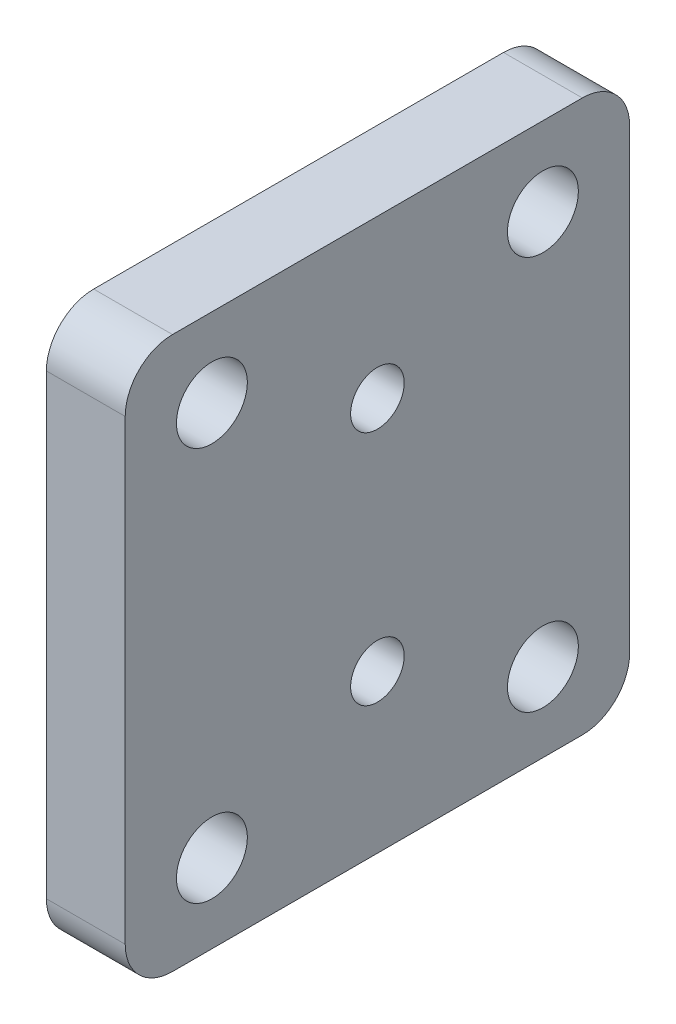
ISO-10303-21;
HEADER;
FILE_DESCRIPTION(('STEP AP214'),'2;1');
FILE_NAME('part.step','',(''),(''),'','','');
FILE_SCHEMA(('AUTOMOTIVE_DESIGN { 1 0 10303 214 1 1 1 1 }'));
ENDSEC;
DATA;
#1=APPLICATION_CONTEXT('core data for automotive mechanical design processes');
#2=APPLICATION_PROTOCOL_DEFINITION('international standard','automotive_design',2000,#1);
#3=PRODUCT_CONTEXT('',#1,'mechanical');
#4=PRODUCT('Part','Part','',(#3));
#5=PRODUCT_RELATED_PRODUCT_CATEGORY('part','',(#4));
#6=PRODUCT_DEFINITION_FORMATION('','',#4);
#7=PRODUCT_DEFINITION_CONTEXT('part definition',#1,'design');
#8=PRODUCT_DEFINITION('design','',#6,#7);
#9=PRODUCT_DEFINITION_SHAPE('','',#8);
#10=(LENGTH_UNIT() NAMED_UNIT(*) SI_UNIT(.MILLI.,.METRE.));
#11=(NAMED_UNIT(*) PLANE_ANGLE_UNIT() SI_UNIT($,.RADIAN.));
#12=(NAMED_UNIT(*) SI_UNIT($,.STERADIAN.) SOLID_ANGLE_UNIT());
#13=UNCERTAINTY_MEASURE_WITH_UNIT(LENGTH_MEASURE(1.E-05),#10,'distance_accuracy_value','');
#14=(GEOMETRIC_REPRESENTATION_CONTEXT(3) GLOBAL_UNCERTAINTY_ASSIGNED_CONTEXT((#13)) GLOBAL_UNIT_ASSIGNED_CONTEXT((#10,
#11,#12)) REPRESENTATION_CONTEXT('',''));
#15=CARTESIAN_POINT('',(0.,0.,0.));
#16=DIRECTION('',(0.,0.,1.));
#17=DIRECTION('',(1.,0.,0.));
#18=AXIS2_PLACEMENT_3D('',#15,#16,#17);
#19=CARTESIAN_POINT('',(0.,0.,0.));
#20=DIRECTION('',(-1.,0.,0.));
#21=DIRECTION('',(0.,0.,1.));
#22=AXIS2_PLACEMENT_3D('',#19,#20,#21);
#23=PLANE('',#22);
#24=CARTESIAN_POINT('',(0.,25.,-16.));
#25=DIRECTION('',(1.,0.,0.));
#26=DIRECTION('',(0.,0.,-1.));
#27=AXIS2_PLACEMENT_3D('',#24,#25,#26);
#28=CIRCLE('',#27,3.);
#29=CARTESIAN_POINT('',(0.,25.,-19.));
#30=VERTEX_POINT('',#29);
#31=EDGE_CURVE('E184',#30,#30,#28,.T.);
#32=ORIENTED_EDGE('',*,*,#31,.T.);
#33=EDGE_LOOP('',(#32));
#34=FACE_BOUND('',#33,.T.);
#35=CARTESIAN_POINT('',(0.,5.,-5.5));
#36=DIRECTION('',(1.,0.,0.));
#37=DIRECTION('',(0.,0.,-1.));
#38=AXIS2_PLACEMENT_3D('',#35,#36,#37);
#39=CIRCLE('',#38,2.25);
#40=CARTESIAN_POINT('',(0.,5.,-7.75));
#41=VERTEX_POINT('',#40);
#42=EDGE_CURVE('E178',#41,#41,#39,.T.);
#43=ORIENTED_EDGE('',*,*,#42,.T.);
#44=EDGE_LOOP('',(#43));
#45=FACE_BOUND('',#44,.T.);
#46=CARTESIAN_POINT('',(0.,30.,-5.5));
#47=DIRECTION('',(1.,0.,0.));
#48=DIRECTION('',(0.,0.,-1.));
#49=AXIS2_PLACEMENT_3D('',#46,#47,#48);
#50=CIRCLE('',#49,2.25);
#51=CARTESIAN_POINT('',(0.,30.,-7.75));
#52=VERTEX_POINT('',#51);
#53=EDGE_CURVE('E170',#52,#52,#50,.T.);
#54=ORIENTED_EDGE('',*,*,#53,.T.);
#55=EDGE_LOOP('',(#54));
#56=FACE_BOUND('',#55,.T.);
#57=DIRECTION('',(0.,0.,1.));
#58=VECTOR('',#57,1.);
#59=CARTESIAN_POINT('',(0.,35.,0.));
#60=LINE('',#59,#58);
#61=CARTESIAN_POINT('',(0.,35.,-29.));
#62=VERTEX_POINT('',#61);
#63=CARTESIAN_POINT('',(0.,35.,-3.));
#64=VERTEX_POINT('',#63);
#65=EDGE_CURVE('E125',#62,#64,#60,.T.);
#66=ORIENTED_EDGE('',*,*,#65,.F.);
#67=CARTESIAN_POINT('',(0.,32.,-29.));
#68=DIRECTION('',(-1.,0.,0.));
#69=DIRECTION('',(0.,0.,1.));
#70=AXIS2_PLACEMENT_3D('',#67,#68,#69);
#71=CIRCLE('',#70,3.);
#72=CARTESIAN_POINT('',(0.,32.,-32.));
#73=VERTEX_POINT('',#72);
#74=EDGE_CURVE('E108',#62,#73,#71,.T.);
#75=ORIENTED_EDGE('',*,*,#74,.T.);
#76=DIRECTION('',(0.,1.,0.));
#77=VECTOR('',#76,1.);
#78=CARTESIAN_POINT('',(0.,0.,-32.));
#79=LINE('',#78,#77);
#80=CARTESIAN_POINT('',(0.,3.,-32.));
#81=VERTEX_POINT('',#80);
#82=EDGE_CURVE('E134',#81,#73,#79,.T.);
#83=ORIENTED_EDGE('',*,*,#82,.F.);
#84=CARTESIAN_POINT('',(0.,3.,-29.));
#85=DIRECTION('',(-1.,0.,0.));
#86=DIRECTION('',(0.,0.,1.));
#87=AXIS2_PLACEMENT_3D('',#84,#85,#86);
#88=CIRCLE('',#87,3.);
#89=CARTESIAN_POINT('',(0.,0.,-29.));
#90=VERTEX_POINT('',#89);
#91=EDGE_CURVE('E119',#81,#90,#88,.T.);
#92=ORIENTED_EDGE('',*,*,#91,.T.);
#93=DIRECTION('',(0.,0.,-1.));
#94=VECTOR('',#93,1.);
#95=CARTESIAN_POINT('',(0.,0.,0.));
#96=LINE('',#95,#94);
#97=CARTESIAN_POINT('',(0.,0.,-3.));
#98=VERTEX_POINT('',#97);
#99=EDGE_CURVE('E137',#98,#90,#96,.T.);
#100=ORIENTED_EDGE('',*,*,#99,.F.);
#101=CARTESIAN_POINT('',(0.,3.,-3.));
#102=DIRECTION('',(-1.,0.,0.));
#103=DIRECTION('',(0.,0.,1.));
#104=AXIS2_PLACEMENT_3D('',#101,#102,#103);
#105=CIRCLE('',#104,3.);
#106=CARTESIAN_POINT('',(0.,3.,0.));
#107=VERTEX_POINT('',#106);
#108=EDGE_CURVE('E142',#98,#107,#105,.T.);
#109=ORIENTED_EDGE('',*,*,#108,.T.);
#110=DIRECTION('',(0.,-1.,0.));
#111=VECTOR('',#110,1.);
#112=CARTESIAN_POINT('',(0.,0.,0.));
#113=LINE('',#112,#111);
#114=CARTESIAN_POINT('',(0.,32.,0.));
#115=VERTEX_POINT('',#114);
#116=EDGE_CURVE('E164',#115,#107,#113,.T.);
#117=ORIENTED_EDGE('',*,*,#116,.F.);
#118=CARTESIAN_POINT('',(0.,32.,-3.));
#119=DIRECTION('',(-1.,0.,0.));
#120=DIRECTION('',(0.,0.,1.));
#121=AXIS2_PLACEMENT_3D('',#118,#119,#120);
#122=CIRCLE('',#121,3.);
#123=EDGE_CURVE('E129',#115,#64,#122,.T.);
#124=ORIENTED_EDGE('',*,*,#123,.T.);
#125=EDGE_LOOP('',(#66,#75,#83,#92,#100,#109,#117,#124));
#126=FACE_BOUND('',#125,.T.);
#127=CARTESIAN_POINT('',(0.,30.,-26.5));
#128=DIRECTION('',(1.,0.,0.));
#129=DIRECTION('',(0.,0.,-1.));
#130=AXIS2_PLACEMENT_3D('',#127,#128,#129);
#131=CIRCLE('',#130,2.25);
#132=CARTESIAN_POINT('',(0.,30.,-28.75));
#133=VERTEX_POINT('',#132);
#134=EDGE_CURVE('E173',#133,#133,#131,.T.);
#135=ORIENTED_EDGE('',*,*,#134,.T.);
#136=EDGE_LOOP('',(#135));
#137=FACE_BOUND('',#136,.T.);
#138=CARTESIAN_POINT('',(0.,5.,-26.5));
#139=DIRECTION('',(1.,0.,0.));
#140=DIRECTION('',(0.,0.,-1.));
#141=AXIS2_PLACEMENT_3D('',#138,#139,#140);
#142=CIRCLE('',#141,2.25);
#143=CARTESIAN_POINT('',(0.,5.,-28.75));
#144=VERTEX_POINT('',#143);
#145=EDGE_CURVE('E181',#144,#144,#142,.T.);
#146=ORIENTED_EDGE('',*,*,#145,.T.);
#147=EDGE_LOOP('',(#146));
#148=FACE_BOUND('',#147,.T.);
#149=CARTESIAN_POINT('',(0.,10.,-16.));
#150=DIRECTION('',(1.,0.,0.));
#151=DIRECTION('',(0.,0.,-1.));
#152=AXIS2_PLACEMENT_3D('',#149,#150,#151);
#153=CIRCLE('',#152,3.);
#154=CARTESIAN_POINT('',(0.,10.,-19.));
#155=VERTEX_POINT('',#154);
#156=EDGE_CURVE('E187',#155,#155,#153,.T.);
#157=ORIENTED_EDGE('',*,*,#156,.T.);
#158=EDGE_LOOP('',(#157));
#159=FACE_BOUND('',#158,.T.);
#160=ADVANCED_FACE('F42',(#34,#45,#56,#126,#137,#148,#159),#23,.T.);
#161=CARTESIAN_POINT('',(2.5,0.,0.));
#162=DIRECTION('',(0.,0.,-1.));
#163=DIRECTION('',(-1.,0.,0.));
#164=AXIS2_PLACEMENT_3D('',#161,#162,#163);
#165=PLANE('',#164);
#166=ORIENTED_EDGE('',*,*,#116,.T.);
#167=DIRECTION('',(-1.,0.,0.));
#168=VECTOR('',#167,1.);
#169=CARTESIAN_POINT('',(2.5,3.,0.));
#170=LINE('',#169,#168);
#171=CARTESIAN_POINT('',(5.,3.,0.));
#172=VERTEX_POINT('',#171);
#173=EDGE_CURVE('E11',#107,#172,#170,.F.);
#174=ORIENTED_EDGE('',*,*,#173,.T.);
#175=DIRECTION('',(0.,-1.,0.));
#176=VECTOR('',#175,1.);
#177=CARTESIAN_POINT('',(5.,35.,0.));
#178=LINE('',#177,#176);
#179=CARTESIAN_POINT('',(5.,32.,0.));
#180=VERTEX_POINT('',#179);
#181=EDGE_CURVE('E166',#180,#172,#178,.T.);
#182=ORIENTED_EDGE('',*,*,#181,.F.);
#183=DIRECTION('',(-1.,0.,0.));
#184=VECTOR('',#183,1.);
#185=CARTESIAN_POINT('',(2.5,32.,0.));
#186=LINE('',#185,#184);
#187=EDGE_CURVE('E50',#180,#115,#186,.T.);
#188=ORIENTED_EDGE('',*,*,#187,.T.);
#189=EDGE_LOOP('',(#166,#174,#182,#188));
#190=FACE_BOUND('',#189,.T.);
#191=ADVANCED_FACE('F163',(#190),#165,.F.);
#192=CARTESIAN_POINT('',(2.5,0.,0.));
#193=DIRECTION('',(0.,1.,0.));
#194=DIRECTION('',(0.,0.,1.));
#195=AXIS2_PLACEMENT_3D('',#192,#193,#194);
#196=PLANE('',#195);
#197=ORIENTED_EDGE('',*,*,#99,.T.);
#198=DIRECTION('',(-1.,0.,0.));
#199=VECTOR('',#198,1.);
#200=CARTESIAN_POINT('',(2.5,0.,-29.));
#201=LINE('',#200,#199);
#202=CARTESIAN_POINT('',(5.,0.,-29.));
#203=VERTEX_POINT('',#202);
#204=EDGE_CURVE('E57',#90,#203,#201,.F.);
#205=ORIENTED_EDGE('',*,*,#204,.T.);
#206=DIRECTION('',(0.,0.,-1.));
#207=VECTOR('',#206,1.);
#208=CARTESIAN_POINT('',(5.,0.,0.));
#209=LINE('',#208,#207);
#210=CARTESIAN_POINT('',(5.,0.,-3.));
#211=VERTEX_POINT('',#210);
#212=EDGE_CURVE('E200',#211,#203,#209,.T.);
#213=ORIENTED_EDGE('',*,*,#212,.F.);
#214=DIRECTION('',(-1.,0.,0.));
#215=VECTOR('',#214,1.);
#216=CARTESIAN_POINT('',(2.5,0.,-3.));
#217=LINE('',#216,#215);
#218=EDGE_CURVE('E155',#211,#98,#217,.T.);
#219=ORIENTED_EDGE('',*,*,#218,.T.);
#220=EDGE_LOOP('',(#197,#205,#213,#219));
#221=FACE_BOUND('',#220,.T.);
#222=ADVANCED_FACE('F257',(#221),#196,.F.);
#223=CARTESIAN_POINT('',(2.5,0.,-32.));
#224=DIRECTION('',(0.,0.,1.));
#225=DIRECTION('',(1.,0.,0.));
#226=AXIS2_PLACEMENT_3D('',#223,#224,#225);
#227=PLANE('',#226);
#228=ORIENTED_EDGE('',*,*,#82,.T.);
#229=DIRECTION('',(-1.,0.,0.));
#230=VECTOR('',#229,1.);
#231=CARTESIAN_POINT('',(2.5,32.,-32.));
#232=LINE('',#231,#230);
#233=CARTESIAN_POINT('',(5.,32.,-32.));
#234=VERTEX_POINT('',#233);
#235=EDGE_CURVE('E113',#73,#234,#232,.F.);
#236=ORIENTED_EDGE('',*,*,#235,.T.);
#237=DIRECTION('',(0.,1.,0.));
#238=VECTOR('',#237,1.);
#239=CARTESIAN_POINT('',(5.,0.,-32.));
#240=LINE('',#239,#238);
#241=CARTESIAN_POINT('',(5.,3.,-32.));
#242=VERTEX_POINT('',#241);
#243=EDGE_CURVE('E197',#242,#234,#240,.T.);
#244=ORIENTED_EDGE('',*,*,#243,.F.);
#245=DIRECTION('',(-1.,0.,0.));
#246=VECTOR('',#245,1.);
#247=CARTESIAN_POINT('',(2.5,3.,-32.));
#248=LINE('',#247,#246);
#249=EDGE_CURVE('E118',#242,#81,#248,.T.);
#250=ORIENTED_EDGE('',*,*,#249,.T.);
#251=EDGE_LOOP('',(#228,#236,#244,#250));
#252=FACE_BOUND('',#251,.T.);
#253=ADVANCED_FACE('F265',(#252),#227,.F.);
#254=CARTESIAN_POINT('',(2.5,35.,0.));
#255=DIRECTION('',(0.,-1.,0.));
#256=DIRECTION('',(0.,0.,-1.));
#257=AXIS2_PLACEMENT_3D('',#254,#255,#256);
#258=PLANE('',#257);
#259=DIRECTION('',(0.,0.,1.));
#260=VECTOR('',#259,1.);
#261=CARTESIAN_POINT('',(5.,35.,-32.));
#262=LINE('',#261,#260);
#263=CARTESIAN_POINT('',(5.,35.,-29.));
#264=VERTEX_POINT('',#263);
#265=CARTESIAN_POINT('',(5.,35.,-3.));
#266=VERTEX_POINT('',#265);
#267=EDGE_CURVE('E128',#264,#266,#262,.T.);
#268=ORIENTED_EDGE('',*,*,#267,.F.);
#269=DIRECTION('',(-1.,0.,0.));
#270=VECTOR('',#269,1.);
#271=CARTESIAN_POINT('',(2.5,35.,-29.));
#272=LINE('',#271,#270);
#273=EDGE_CURVE('E112',#264,#62,#272,.T.);
#274=ORIENTED_EDGE('',*,*,#273,.T.);
#275=ORIENTED_EDGE('',*,*,#65,.T.);
#276=DIRECTION('',(-1.,0.,0.));
#277=VECTOR('',#276,1.);
#278=CARTESIAN_POINT('',(2.5,35.,-3.));
#279=LINE('',#278,#277);
#280=EDGE_CURVE('E130',#64,#266,#279,.F.);
#281=ORIENTED_EDGE('',*,*,#280,.T.);
#282=EDGE_LOOP('',(#268,#274,#275,#281));
#283=FACE_BOUND('',#282,.T.);
#284=ADVANCED_FACE('F124',(#283),#258,.F.);
#285=CARTESIAN_POINT('',(2.5,30.,-5.5));
#286=DIRECTION('',(-1.,0.,0.));
#287=DIRECTION('',(0.,0.,1.));
#288=AXIS2_PLACEMENT_3D('',#285,#286,#287);
#289=CYLINDRICAL_SURFACE('',#288,2.25);
#290=ORIENTED_EDGE('',*,*,#53,.F.);
#291=EDGE_LOOP('',(#290));
#292=FACE_BOUND('',#291,.T.);
#293=CARTESIAN_POINT('',(5.,30.,-5.5));
#294=DIRECTION('',(1.,0.,0.));
#295=DIRECTION('',(0.,0.,-1.));
#296=AXIS2_PLACEMENT_3D('',#293,#294,#295);
#297=CIRCLE('',#296,2.25);
#298=CARTESIAN_POINT('',(5.,30.,-7.75));
#299=VERTEX_POINT('',#298);
#300=EDGE_CURVE('E212',#299,#299,#297,.T.);
#301=ORIENTED_EDGE('',*,*,#300,.T.);
#302=EDGE_LOOP('',(#301));
#303=FACE_BOUND('',#302,.T.);
#304=ADVANCED_FACE('F262',(#292,#303),#289,.F.);
#305=CARTESIAN_POINT('',(2.5,30.,-26.5));
#306=DIRECTION('',(-1.,0.,0.));
#307=DIRECTION('',(0.,0.,1.));
#308=AXIS2_PLACEMENT_3D('',#305,#306,#307);
#309=CYLINDRICAL_SURFACE('',#308,2.25);
#310=ORIENTED_EDGE('',*,*,#134,.F.);
#311=EDGE_LOOP('',(#310));
#312=FACE_BOUND('',#311,.T.);
#313=CARTESIAN_POINT('',(5.,30.,-26.5));
#314=DIRECTION('',(1.,0.,0.));
#315=DIRECTION('',(0.,0.,-1.));
#316=AXIS2_PLACEMENT_3D('',#313,#314,#315);
#317=CIRCLE('',#316,2.25);
#318=CARTESIAN_POINT('',(5.,30.,-28.75));
#319=VERTEX_POINT('',#318);
#320=EDGE_CURVE('E209',#319,#319,#317,.T.);
#321=ORIENTED_EDGE('',*,*,#320,.T.);
#322=EDGE_LOOP('',(#321));
#323=FACE_BOUND('',#322,.T.);
#324=ADVANCED_FACE('F292',(#312,#323),#309,.F.);
#325=CARTESIAN_POINT('',(2.5,5.,-5.5));
#326=DIRECTION('',(-1.,0.,0.));
#327=DIRECTION('',(0.,0.,1.));
#328=AXIS2_PLACEMENT_3D('',#325,#326,#327);
#329=CYLINDRICAL_SURFACE('',#328,2.25);
#330=ORIENTED_EDGE('',*,*,#42,.F.);
#331=EDGE_LOOP('',(#330));
#332=FACE_BOUND('',#331,.T.);
#333=CARTESIAN_POINT('',(5.,5.,-5.5));
#334=DIRECTION('',(1.,0.,0.));
#335=DIRECTION('',(0.,0.,-1.));
#336=AXIS2_PLACEMENT_3D('',#333,#334,#335);
#337=CIRCLE('',#336,2.25);
#338=CARTESIAN_POINT('',(5.,5.,-7.75));
#339=VERTEX_POINT('',#338);
#340=EDGE_CURVE('E206',#339,#339,#337,.T.);
#341=ORIENTED_EDGE('',*,*,#340,.T.);
#342=EDGE_LOOP('',(#341));
#343=FACE_BOUND('',#342,.T.);
#344=ADVANCED_FACE('F298',(#332,#343),#329,.F.);
#345=CARTESIAN_POINT('',(2.5,5.,-26.5));
#346=DIRECTION('',(-1.,0.,0.));
#347=DIRECTION('',(0.,0.,1.));
#348=AXIS2_PLACEMENT_3D('',#345,#346,#347);
#349=CYLINDRICAL_SURFACE('',#348,2.25);
#350=ORIENTED_EDGE('',*,*,#145,.F.);
#351=EDGE_LOOP('',(#350));
#352=FACE_BOUND('',#351,.T.);
#353=CARTESIAN_POINT('',(5.,5.,-26.5));
#354=DIRECTION('',(1.,0.,0.));
#355=DIRECTION('',(0.,0.,-1.));
#356=AXIS2_PLACEMENT_3D('',#353,#354,#355);
#357=CIRCLE('',#356,2.25);
#358=CARTESIAN_POINT('',(5.,5.,-28.75));
#359=VERTEX_POINT('',#358);
#360=EDGE_CURVE('E203',#359,#359,#357,.T.);
#361=ORIENTED_EDGE('',*,*,#360,.T.);
#362=EDGE_LOOP('',(#361));
#363=FACE_BOUND('',#362,.T.);
#364=ADVANCED_FACE('F305',(#352,#363),#349,.F.);
#365=CARTESIAN_POINT('',(2.5,25.,-16.));
#366=DIRECTION('',(-1.,0.,0.));
#367=DIRECTION('',(0.,0.,1.));
#368=AXIS2_PLACEMENT_3D('',#365,#366,#367);
#369=CYLINDRICAL_SURFACE('',#368,3.);
#370=CARTESIAN_POINT('',(2.5,25.,-16.));
#371=DIRECTION('',(1.,0.,0.));
#372=DIRECTION('',(0.,0.,-1.));
#373=AXIS2_PLACEMENT_3D('',#370,#371,#372);
#374=CIRCLE('',#373,3.);
#375=CARTESIAN_POINT('',(2.5,25.,-19.));
#376=VERTEX_POINT('',#375);
#377=EDGE_CURVE('E188',#376,#376,#374,.T.);
#378=ORIENTED_EDGE('',*,*,#377,.T.);
#379=EDGE_LOOP('',(#378));
#380=FACE_BOUND('',#379,.T.);
#381=ORIENTED_EDGE('',*,*,#31,.F.);
#382=EDGE_LOOP('',(#381));
#383=FACE_BOUND('',#382,.T.);
#384=ADVANCED_FACE('F313',(#380,#383),#369,.F.);
#385=CARTESIAN_POINT('',(2.5,10.,-16.));
#386=DIRECTION('',(-1.,0.,0.));
#387=DIRECTION('',(0.,0.,1.));
#388=AXIS2_PLACEMENT_3D('',#385,#386,#387);
#389=CYLINDRICAL_SURFACE('',#388,3.);
#390=CARTESIAN_POINT('',(2.5,10.,-16.));
#391=DIRECTION('',(1.,0.,0.));
#392=DIRECTION('',(0.,0.,-1.));
#393=AXIS2_PLACEMENT_3D('',#390,#391,#392);
#394=CIRCLE('',#393,3.);
#395=CARTESIAN_POINT('',(2.5,10.,-19.));
#396=VERTEX_POINT('',#395);
#397=EDGE_CURVE('E191',#396,#396,#394,.T.);
#398=ORIENTED_EDGE('',*,*,#397,.T.);
#399=EDGE_LOOP('',(#398));
#400=FACE_BOUND('',#399,.T.);
#401=ORIENTED_EDGE('',*,*,#156,.F.);
#402=EDGE_LOOP('',(#401));
#403=FACE_BOUND('',#402,.T.);
#404=ADVANCED_FACE('F317',(#400,#403),#389,.F.);
#405=CARTESIAN_POINT('',(2.5,0.,0.));
#406=DIRECTION('',(1.,0.,0.));
#407=DIRECTION('',(0.,0.,-1.));
#408=AXIS2_PLACEMENT_3D('',#405,#406,#407);
#409=PLANE('',#408);
#410=CARTESIAN_POINT('',(2.5,25.,-16.));
#411=DIRECTION('',(1.,0.,0.));
#412=DIRECTION('',(0.,0.,-1.));
#413=AXIS2_PLACEMENT_3D('',#410,#411,#412);
#414=CIRCLE('',#413,1.7);
#415=CARTESIAN_POINT('',(2.5,25.,-17.7));
#416=VERTEX_POINT('',#415);
#417=EDGE_CURVE('E222',#416,#416,#414,.T.);
#418=ORIENTED_EDGE('',*,*,#417,.T.);
#419=EDGE_LOOP('',(#418));
#420=FACE_BOUND('',#419,.T.);
#421=ORIENTED_EDGE('',*,*,#377,.F.);
#422=EDGE_LOOP('',(#421));
#423=FACE_BOUND('',#422,.T.);
#424=ADVANCED_FACE('F245',(#420,#423),#409,.F.);
#425=CARTESIAN_POINT('',(2.5,10.,-16.));
#426=DIRECTION('',(1.,0.,0.));
#427=DIRECTION('',(0.,0.,-1.));
#428=AXIS2_PLACEMENT_3D('',#425,#426,#427);
#429=CIRCLE('',#428,1.7);
#430=CARTESIAN_POINT('',(2.5,10.,-17.7));
#431=VERTEX_POINT('',#430);
#432=EDGE_CURVE('E216',#431,#431,#429,.T.);
#433=ORIENTED_EDGE('',*,*,#432,.T.);
#434=EDGE_LOOP('',(#433));
#435=FACE_BOUND('',#434,.T.);
#436=ORIENTED_EDGE('',*,*,#397,.F.);
#437=EDGE_LOOP('',(#436));
#438=FACE_BOUND('',#437,.T.);
#439=ADVANCED_FACE('F234',(#435,#438),#409,.F.);
#440=CARTESIAN_POINT('',(5.,0.,0.));
#441=DIRECTION('',(1.,0.,0.));
#442=DIRECTION('',(0.,0.,-1.));
#443=AXIS2_PLACEMENT_3D('',#440,#441,#442);
#444=PLANE('',#443);
#445=CARTESIAN_POINT('',(5.,10.,-16.));
#446=DIRECTION('',(1.,0.,0.));
#447=DIRECTION('',(0.,0.,-1.));
#448=AXIS2_PLACEMENT_3D('',#445,#446,#447);
#449=CIRCLE('',#448,1.7);
#450=CARTESIAN_POINT('',(5.,10.,-17.7));
#451=VERTEX_POINT('',#450);
#452=EDGE_CURVE('E215',#451,#451,#449,.T.);
#453=ORIENTED_EDGE('',*,*,#452,.F.);
#454=EDGE_LOOP('',(#453));
#455=FACE_BOUND('',#454,.T.);
#456=ORIENTED_EDGE('',*,*,#320,.F.);
#457=EDGE_LOOP('',(#456));
#458=FACE_BOUND('',#457,.T.);
#459=ORIENTED_EDGE('',*,*,#360,.F.);
#460=EDGE_LOOP('',(#459));
#461=FACE_BOUND('',#460,.T.);
#462=ORIENTED_EDGE('',*,*,#243,.T.);
#463=CARTESIAN_POINT('',(5.,32.,-29.));
#464=DIRECTION('',(1.,0.,0.));
#465=DIRECTION('',(0.,0.,-1.));
#466=AXIS2_PLACEMENT_3D('',#463,#464,#465);
#467=CIRCLE('',#466,3.);
#468=EDGE_CURVE('E153',#234,#264,#467,.T.);
#469=ORIENTED_EDGE('',*,*,#468,.T.);
#470=ORIENTED_EDGE('',*,*,#267,.T.);
#471=CARTESIAN_POINT('',(5.,32.,-3.));
#472=DIRECTION('',(1.,0.,0.));
#473=DIRECTION('',(0.,0.,-1.));
#474=AXIS2_PLACEMENT_3D('',#471,#472,#473);
#475=CIRCLE('',#474,3.);
#476=EDGE_CURVE('E148',#266,#180,#475,.T.);
#477=ORIENTED_EDGE('',*,*,#476,.T.);
#478=ORIENTED_EDGE('',*,*,#181,.T.);
#479=CARTESIAN_POINT('',(5.,3.,-3.));
#480=DIRECTION('',(1.,0.,0.));
#481=DIRECTION('',(0.,0.,-1.));
#482=AXIS2_PLACEMENT_3D('',#479,#480,#481);
#483=CIRCLE('',#482,3.);
#484=EDGE_CURVE('E64',#172,#211,#483,.T.);
#485=ORIENTED_EDGE('',*,*,#484,.T.);
#486=ORIENTED_EDGE('',*,*,#212,.T.);
#487=CARTESIAN_POINT('',(5.,3.,-29.));
#488=DIRECTION('',(1.,0.,0.));
#489=DIRECTION('',(0.,0.,-1.));
#490=AXIS2_PLACEMENT_3D('',#487,#488,#489);
#491=CIRCLE('',#490,3.);
#492=EDGE_CURVE('E151',#203,#242,#491,.T.);
#493=ORIENTED_EDGE('',*,*,#492,.T.);
#494=EDGE_LOOP('',(#462,#469,#470,#477,#478,#485,#486,#493));
#495=FACE_BOUND('',#494,.T.);
#496=ORIENTED_EDGE('',*,*,#340,.F.);
#497=EDGE_LOOP('',(#496));
#498=FACE_BOUND('',#497,.T.);
#499=ORIENTED_EDGE('',*,*,#300,.F.);
#500=EDGE_LOOP('',(#499));
#501=FACE_BOUND('',#500,.T.);
#502=CARTESIAN_POINT('',(5.,25.,-16.));
#503=DIRECTION('',(1.,0.,0.));
#504=DIRECTION('',(0.,0.,-1.));
#505=AXIS2_PLACEMENT_3D('',#502,#503,#504);
#506=CIRCLE('',#505,1.7);
#507=CARTESIAN_POINT('',(5.,25.,-17.7));
#508=VERTEX_POINT('',#507);
#509=EDGE_CURVE('E219',#508,#508,#506,.T.);
#510=ORIENTED_EDGE('',*,*,#509,.F.);
#511=EDGE_LOOP('',(#510));
#512=FACE_BOUND('',#511,.T.);
#513=ADVANCED_FACE('F231',(#455,#458,#461,#495,#498,#501,#512),#444,.T.);
#514=CARTESIAN_POINT('',(5.,10.,-16.));
#515=DIRECTION('',(-1.,0.,0.));
#516=DIRECTION('',(0.,0.,1.));
#517=AXIS2_PLACEMENT_3D('',#514,#515,#516);
#518=CYLINDRICAL_SURFACE('',#517,1.7);
#519=ORIENTED_EDGE('',*,*,#452,.T.);
#520=EDGE_LOOP('',(#519));
#521=FACE_BOUND('',#520,.T.);
#522=ORIENTED_EDGE('',*,*,#432,.F.);
#523=EDGE_LOOP('',(#522));
#524=FACE_BOUND('',#523,.T.);
#525=ADVANCED_FACE('F233',(#521,#524),#518,.F.);
#526=CARTESIAN_POINT('',(5.,25.,-16.));
#527=DIRECTION('',(-1.,0.,0.));
#528=DIRECTION('',(0.,0.,1.));
#529=AXIS2_PLACEMENT_3D('',#526,#527,#528);
#530=CYLINDRICAL_SURFACE('',#529,1.7);
#531=ORIENTED_EDGE('',*,*,#509,.T.);
#532=EDGE_LOOP('',(#531));
#533=FACE_BOUND('',#532,.T.);
#534=ORIENTED_EDGE('',*,*,#417,.F.);
#535=EDGE_LOOP('',(#534));
#536=FACE_BOUND('',#535,.T.);
#537=ADVANCED_FACE('F228',(#533,#536),#530,.F.);
#538=CARTESIAN_POINT('',(2.5,32.,-29.));
#539=DIRECTION('',(-1.,0.,0.));
#540=DIRECTION('',(0.,0.,1.));
#541=AXIS2_PLACEMENT_3D('',#538,#539,#540);
#542=CYLINDRICAL_SURFACE('',#541,3.);
#543=ORIENTED_EDGE('',*,*,#468,.F.);
#544=ORIENTED_EDGE('',*,*,#235,.F.);
#545=ORIENTED_EDGE('',*,*,#74,.F.);
#546=ORIENTED_EDGE('',*,*,#273,.F.);
#547=EDGE_LOOP('',(#543,#544,#545,#546));
#548=FACE_BOUND('',#547,.T.);
#549=ADVANCED_FACE('F111',(#548),#542,.T.);
#550=CARTESIAN_POINT('',(2.5,3.,-29.));
#551=DIRECTION('',(-1.,0.,0.));
#552=DIRECTION('',(0.,0.,1.));
#553=AXIS2_PLACEMENT_3D('',#550,#551,#552);
#554=CYLINDRICAL_SURFACE('',#553,3.);
#555=ORIENTED_EDGE('',*,*,#492,.F.);
#556=ORIENTED_EDGE('',*,*,#204,.F.);
#557=ORIENTED_EDGE('',*,*,#91,.F.);
#558=ORIENTED_EDGE('',*,*,#249,.F.);
#559=EDGE_LOOP('',(#555,#556,#557,#558));
#560=FACE_BOUND('',#559,.T.);
#561=ADVANCED_FACE('F273',(#560),#554,.T.);
#562=CARTESIAN_POINT('',(2.5,3.,-3.));
#563=DIRECTION('',(-1.,0.,0.));
#564=DIRECTION('',(0.,0.,1.));
#565=AXIS2_PLACEMENT_3D('',#562,#563,#564);
#566=CYLINDRICAL_SURFACE('',#565,3.);
#567=ORIENTED_EDGE('',*,*,#484,.F.);
#568=ORIENTED_EDGE('',*,*,#173,.F.);
#569=ORIENTED_EDGE('',*,*,#108,.F.);
#570=ORIENTED_EDGE('',*,*,#218,.F.);
#571=EDGE_LOOP('',(#567,#568,#569,#570));
#572=FACE_BOUND('',#571,.T.);
#573=ADVANCED_FACE('F275',(#572),#566,.T.);
#574=CARTESIAN_POINT('',(2.5,32.,-3.));
#575=DIRECTION('',(-1.,0.,0.));
#576=DIRECTION('',(0.,0.,1.));
#577=AXIS2_PLACEMENT_3D('',#574,#575,#576);
#578=CYLINDRICAL_SURFACE('',#577,3.);
#579=ORIENTED_EDGE('',*,*,#476,.F.);
#580=ORIENTED_EDGE('',*,*,#280,.F.);
#581=ORIENTED_EDGE('',*,*,#123,.F.);
#582=ORIENTED_EDGE('',*,*,#187,.F.);
#583=EDGE_LOOP('',(#579,#580,#581,#582));
#584=FACE_BOUND('',#583,.T.);
#585=ADVANCED_FACE('F44',(#584),#578,.T.);
#586=CLOSED_SHELL('',(#160,#191,#222,#253,#284,#304,#324,#344,#364,#384,#404,#424,#439,#513,
#525,#537,#549,#561,#573,#585));
#587=MANIFOLD_SOLID_BREP('B2',#586);
#588=ADVANCED_BREP_SHAPE_REPRESENTATION('',(#18,#587),#14);
#589=SHAPE_DEFINITION_REPRESENTATION(#9,#588);
ENDSEC;
END-ISO-10303-21;
